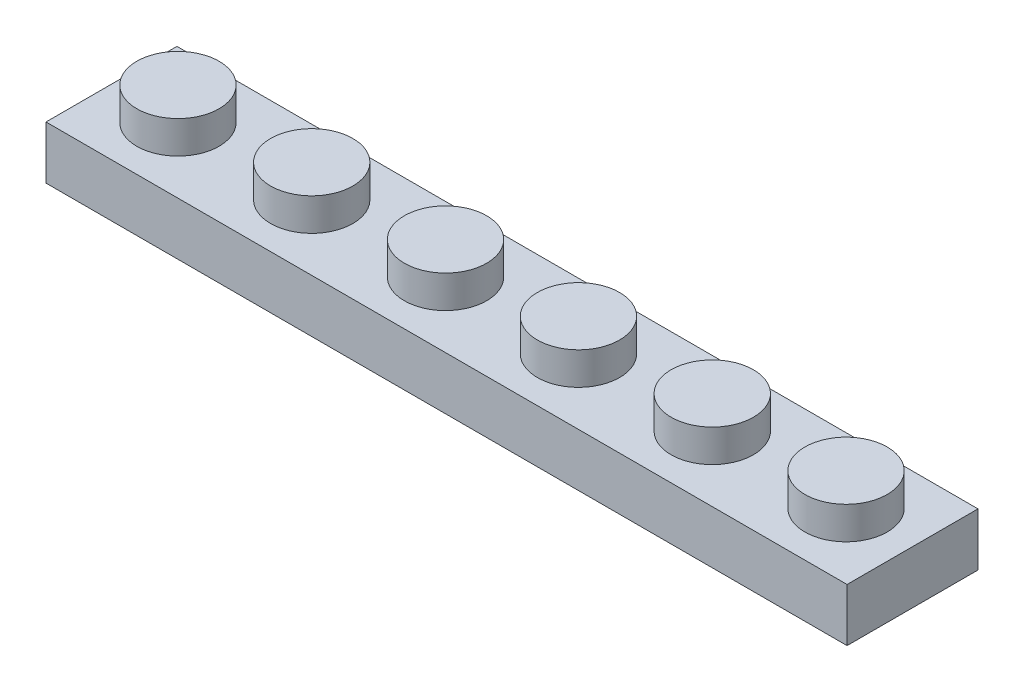
ISO-10303-21;
HEADER;
FILE_DESCRIPTION(('STEP AP214'),'2;1');
FILE_NAME('part.step','',(''),(''),'','','');
FILE_SCHEMA(('AUTOMOTIVE_DESIGN { 1 0 10303 214 1 1 1 1 }'));
ENDSEC;
DATA;
#1=APPLICATION_CONTEXT('core data for automotive mechanical design processes');
#2=APPLICATION_PROTOCOL_DEFINITION('international standard','automotive_design',2000,#1);
#3=PRODUCT_CONTEXT('',#1,'mechanical');
#4=PRODUCT('Part','Part','',(#3));
#5=PRODUCT_RELATED_PRODUCT_CATEGORY('part','',(#4));
#6=PRODUCT_DEFINITION_FORMATION('','',#4);
#7=PRODUCT_DEFINITION_CONTEXT('part definition',#1,'design');
#8=PRODUCT_DEFINITION('design','',#6,#7);
#9=PRODUCT_DEFINITION_SHAPE('','',#8);
#10=(LENGTH_UNIT() NAMED_UNIT(*) SI_UNIT(.MILLI.,.METRE.));
#11=(NAMED_UNIT(*) PLANE_ANGLE_UNIT() SI_UNIT($,.RADIAN.));
#12=(NAMED_UNIT(*) SI_UNIT($,.STERADIAN.) SOLID_ANGLE_UNIT());
#13=UNCERTAINTY_MEASURE_WITH_UNIT(LENGTH_MEASURE(1.E-05),#10,'distance_accuracy_value','');
#14=(GEOMETRIC_REPRESENTATION_CONTEXT(3) GLOBAL_UNCERTAINTY_ASSIGNED_CONTEXT((#13)) GLOBAL_UNIT_ASSIGNED_CONTEXT((#10,
#11,#12)) REPRESENTATION_CONTEXT('',''));
#15=CARTESIAN_POINT('',(0.,0.,0.));
#16=DIRECTION('',(0.,0.,1.));
#17=DIRECTION('',(1.,0.,0.));
#18=AXIS2_PLACEMENT_3D('',#15,#16,#17);
#19=CARTESIAN_POINT('',(-23.89,-1.58,-7.81));
#20=DIRECTION('',(0.,-1.,0.));
#21=DIRECTION('',(0.,0.,-1.));
#22=AXIS2_PLACEMENT_3D('',#19,#20,#21);
#23=PLANE('',#22);
#24=DIRECTION('',(1.,0.,0.));
#25=VECTOR('',#24,1.);
#26=CARTESIAN_POINT('',(-23.89,-1.58,0.));
#27=LINE('',#26,#25);
#28=CARTESIAN_POINT('',(-23.89,-1.58,0.));
#29=VERTEX_POINT('',#28);
#30=CARTESIAN_POINT('',(23.89,-1.58,0.));
#31=VERTEX_POINT('',#30);
#32=EDGE_CURVE('E229',#29,#31,#27,.T.);
#33=ORIENTED_EDGE('',*,*,#32,.F.);
#34=DIRECTION('',(0.,0.,1.));
#35=VECTOR('',#34,1.);
#36=CARTESIAN_POINT('',(-23.89,-1.58,-7.81));
#37=LINE('',#36,#35);
#38=CARTESIAN_POINT('',(-23.89,-1.58,-7.81));
#39=VERTEX_POINT('',#38);
#40=EDGE_CURVE('E248',#39,#29,#37,.T.);
#41=ORIENTED_EDGE('',*,*,#40,.F.);
#42=DIRECTION('',(1.,0.,0.));
#43=VECTOR('',#42,1.);
#44=CARTESIAN_POINT('',(-23.89,-1.58,-7.81));
#45=LINE('',#44,#43);
#46=CARTESIAN_POINT('',(23.89,-1.58,-7.81));
#47=VERTEX_POINT('',#46);
#48=EDGE_CURVE('E234',#39,#47,#45,.T.);
#49=ORIENTED_EDGE('',*,*,#48,.T.);
#50=DIRECTION('',(0.,0.,1.));
#51=VECTOR('',#50,1.);
#52=CARTESIAN_POINT('',(23.89,-1.58,-7.81));
#53=LINE('',#52,#51);
#54=EDGE_CURVE('E59',#47,#31,#53,.T.);
#55=ORIENTED_EDGE('',*,*,#54,.T.);
#56=EDGE_LOOP('',(#33,#41,#49,#55));
#57=FACE_BOUND('',#56,.T.);
#58=DIRECTION('',(0.,0.,1.));
#59=VECTOR('',#58,1.);
#60=CARTESIAN_POINT('',(-22.29,-1.58,-7.81));
#61=LINE('',#60,#59);
#62=CARTESIAN_POINT('',(-22.29,-1.58,-6.21));
#63=VERTEX_POINT('',#62);
#64=CARTESIAN_POINT('',(-22.29,-1.58,-1.6));
#65=VERTEX_POINT('',#64);
#66=EDGE_CURVE('E171',#63,#65,#61,.T.);
#67=ORIENTED_EDGE('',*,*,#66,.T.);
#68=DIRECTION('',(1.,0.,0.));
#69=VECTOR('',#68,1.);
#70=CARTESIAN_POINT('',(0.,-1.58,-1.6));
#71=LINE('',#70,#69);
#72=CARTESIAN_POINT('',(22.29,-1.58,-1.6));
#73=VERTEX_POINT('',#72);
#74=EDGE_CURVE('E143',#65,#73,#71,.T.);
#75=ORIENTED_EDGE('',*,*,#74,.T.);
#76=DIRECTION('',(0.,0.,1.));
#77=VECTOR('',#76,1.);
#78=CARTESIAN_POINT('',(22.29,-1.58,-7.81));
#79=LINE('',#78,#77);
#80=CARTESIAN_POINT('',(22.29,-1.58,-6.21));
#81=VERTEX_POINT('',#80);
#82=EDGE_CURVE('E132',#81,#73,#79,.T.);
#83=ORIENTED_EDGE('',*,*,#82,.F.);
#84=DIRECTION('',(1.,0.,0.));
#85=VECTOR('',#84,1.);
#86=CARTESIAN_POINT('',(0.,-1.58,-6.21));
#87=LINE('',#86,#85);
#88=EDGE_CURVE('E50',#63,#81,#87,.T.);
#89=ORIENTED_EDGE('',*,*,#88,.F.);
#90=EDGE_LOOP('',(#67,#75,#83,#89));
#91=FACE_BOUND('',#90,.T.);
#92=ADVANCED_FACE('F35',(#57,#91),#23,.T.);
#93=CARTESIAN_POINT('',(23.89,1.58,-7.81));
#94=DIRECTION('',(1.,0.,0.));
#95=DIRECTION('',(0.,0.,-1.));
#96=AXIS2_PLACEMENT_3D('',#93,#94,#95);
#97=PLANE('',#96);
#98=DIRECTION('',(0.,1.,0.));
#99=VECTOR('',#98,1.);
#100=CARTESIAN_POINT('',(23.89,1.58,0.));
#101=LINE('',#100,#99);
#102=CARTESIAN_POINT('',(23.89,1.58,0.));
#103=VERTEX_POINT('',#102);
#104=EDGE_CURVE('E223',#31,#103,#101,.T.);
#105=ORIENTED_EDGE('',*,*,#104,.F.);
#106=ORIENTED_EDGE('',*,*,#54,.F.);
#107=DIRECTION('',(0.,1.,0.));
#108=VECTOR('',#107,1.);
#109=CARTESIAN_POINT('',(23.89,1.58,-7.81));
#110=LINE('',#109,#108);
#111=CARTESIAN_POINT('',(23.89,1.58,-7.81));
#112=VERTEX_POINT('',#111);
#113=EDGE_CURVE('E226',#47,#112,#110,.T.);
#114=ORIENTED_EDGE('',*,*,#113,.T.);
#115=DIRECTION('',(0.,0.,1.));
#116=VECTOR('',#115,1.);
#117=CARTESIAN_POINT('',(23.89,1.58,-7.81));
#118=LINE('',#117,#116);
#119=EDGE_CURVE('E85',#112,#103,#118,.T.);
#120=ORIENTED_EDGE('',*,*,#119,.T.);
#121=EDGE_LOOP('',(#105,#106,#114,#120));
#122=FACE_BOUND('',#121,.T.);
#123=ADVANCED_FACE('F37',(#122),#97,.T.);
#124=CARTESIAN_POINT('',(-23.89,1.58,-7.81));
#125=DIRECTION('',(-1.,0.,0.));
#126=DIRECTION('',(0.,0.,1.));
#127=AXIS2_PLACEMENT_3D('',#124,#125,#126);
#128=PLANE('',#127);
#129=DIRECTION('',(0.,-1.,0.));
#130=VECTOR('',#129,1.);
#131=CARTESIAN_POINT('',(-23.89,1.58,0.));
#132=LINE('',#131,#130);
#133=CARTESIAN_POINT('',(-23.89,1.58,0.));
#134=VERTEX_POINT('',#133);
#135=EDGE_CURVE('E241',#134,#29,#132,.T.);
#136=ORIENTED_EDGE('',*,*,#135,.F.);
#137=DIRECTION('',(0.,0.,1.));
#138=VECTOR('',#137,1.);
#139=CARTESIAN_POINT('',(-23.89,1.58,-7.81));
#140=LINE('',#139,#138);
#141=CARTESIAN_POINT('',(-23.89,1.58,-7.81));
#142=VERTEX_POINT('',#141);
#143=EDGE_CURVE('E250',#142,#134,#140,.T.);
#144=ORIENTED_EDGE('',*,*,#143,.F.);
#145=DIRECTION('',(0.,-1.,0.));
#146=VECTOR('',#145,1.);
#147=CARTESIAN_POINT('',(-23.89,1.58,-7.81));
#148=LINE('',#147,#146);
#149=EDGE_CURVE('E231',#142,#39,#148,.T.);
#150=ORIENTED_EDGE('',*,*,#149,.T.);
#151=ORIENTED_EDGE('',*,*,#40,.T.);
#152=EDGE_LOOP('',(#136,#144,#150,#151));
#153=FACE_BOUND('',#152,.T.);
#154=ADVANCED_FACE('F310',(#153),#128,.T.);
#155=CARTESIAN_POINT('',(-23.89,1.58,-7.81));
#156=DIRECTION('',(0.,1.,0.));
#157=DIRECTION('',(0.,0.,1.));
#158=AXIS2_PLACEMENT_3D('',#155,#156,#157);
#159=PLANE('',#158);
#160=CARTESIAN_POINT('',(19.925,1.58,-3.905));
#161=DIRECTION('',(0.,1.,0.));
#162=DIRECTION('',(0.,0.,-1.));
#163=AXIS2_PLACEMENT_3D('',#160,#161,#162);
#164=CIRCLE('',#163,2.455);
#165=CARTESIAN_POINT('',(19.925,1.58,-6.36));
#166=VERTEX_POINT('',#165);
#167=EDGE_CURVE('E185',#166,#166,#164,.T.);
#168=ORIENTED_EDGE('',*,*,#167,.F.);
#169=EDGE_LOOP('',(#168));
#170=FACE_BOUND('',#169,.T.);
#171=CARTESIAN_POINT('',(11.945,1.58,-3.905));
#172=DIRECTION('',(0.,1.,0.));
#173=DIRECTION('',(0.,0.,-1.));
#174=AXIS2_PLACEMENT_3D('',#171,#172,#173);
#175=CIRCLE('',#174,2.455);
#176=CARTESIAN_POINT('',(11.945,1.58,-6.36));
#177=VERTEX_POINT('',#176);
#178=EDGE_CURVE('E193',#177,#177,#175,.T.);
#179=ORIENTED_EDGE('',*,*,#178,.F.);
#180=EDGE_LOOP('',(#179));
#181=FACE_BOUND('',#180,.T.);
#182=CARTESIAN_POINT('',(3.96500000000001,1.58,-3.905));
#183=DIRECTION('',(0.,1.,0.));
#184=DIRECTION('',(0.,0.,-1.));
#185=AXIS2_PLACEMENT_3D('',#182,#183,#184);
#186=CIRCLE('',#185,2.455);
#187=CARTESIAN_POINT('',(3.96500000000001,1.58,-6.36));
#188=VERTEX_POINT('',#187);
#189=EDGE_CURVE('E199',#188,#188,#186,.T.);
#190=ORIENTED_EDGE('',*,*,#189,.F.);
#191=EDGE_LOOP('',(#190));
#192=FACE_BOUND('',#191,.T.);
#193=CARTESIAN_POINT('',(-3.96500000000001,1.58,-3.905));
#194=DIRECTION('',(0.,1.,0.));
#195=DIRECTION('',(0.,0.,1.));
#196=AXIS2_PLACEMENT_3D('',#193,#194,#195);
#197=CIRCLE('',#196,2.455);
#198=CARTESIAN_POINT('',(-3.96500000000001,1.58,-1.45));
#199=VERTEX_POINT('',#198);
#200=EDGE_CURVE('E205',#199,#199,#197,.T.);
#201=ORIENTED_EDGE('',*,*,#200,.F.);
#202=EDGE_LOOP('',(#201));
#203=FACE_BOUND('',#202,.T.);
#204=CARTESIAN_POINT('',(-11.945,1.58,-3.905));
#205=DIRECTION('',(0.,1.,0.));
#206=DIRECTION('',(0.,0.,1.));
#207=AXIS2_PLACEMENT_3D('',#204,#205,#206);
#208=CIRCLE('',#207,2.455);
#209=CARTESIAN_POINT('',(-11.945,1.58,-1.45));
#210=VERTEX_POINT('',#209);
#211=EDGE_CURVE('E211',#210,#210,#208,.T.);
#212=ORIENTED_EDGE('',*,*,#211,.F.);
#213=EDGE_LOOP('',(#212));
#214=FACE_BOUND('',#213,.T.);
#215=CARTESIAN_POINT('',(-19.925,1.58,-3.905));
#216=DIRECTION('',(0.,1.,0.));
#217=DIRECTION('',(0.,0.,1.));
#218=AXIS2_PLACEMENT_3D('',#215,#216,#217);
#219=CIRCLE('',#218,2.455);
#220=CARTESIAN_POINT('',(-19.925,1.58,-1.45));
#221=VERTEX_POINT('',#220);
#222=EDGE_CURVE('E217',#221,#221,#219,.T.);
#223=ORIENTED_EDGE('',*,*,#222,.F.);
#224=EDGE_LOOP('',(#223));
#225=FACE_BOUND('',#224,.T.);
#226=DIRECTION('',(-1.,0.,0.));
#227=VECTOR('',#226,1.);
#228=CARTESIAN_POINT('',(-23.89,1.58,0.));
#229=LINE('',#228,#227);
#230=EDGE_CURVE('E238',#103,#134,#229,.T.);
#231=ORIENTED_EDGE('',*,*,#230,.F.);
#232=ORIENTED_EDGE('',*,*,#119,.F.);
#233=DIRECTION('',(-1.,0.,0.));
#234=VECTOR('',#233,1.);
#235=CARTESIAN_POINT('',(-23.89,1.58,-7.81));
#236=LINE('',#235,#234);
#237=EDGE_CURVE('E228',#112,#142,#236,.T.);
#238=ORIENTED_EDGE('',*,*,#237,.T.);
#239=ORIENTED_EDGE('',*,*,#143,.T.);
#240=EDGE_LOOP('',(#231,#232,#238,#239));
#241=FACE_BOUND('',#240,.T.);
#242=ADVANCED_FACE('F317',(#170,#181,#192,#203,#214,#225,#241),#159,.T.);
#243=CARTESIAN_POINT('',(0.,0.,-7.81));
#244=DIRECTION('',(0.,0.,1.));
#245=DIRECTION('',(1.,0.,0.));
#246=AXIS2_PLACEMENT_3D('',#243,#244,#245);
#247=PLANE('',#246);
#248=ORIENTED_EDGE('',*,*,#113,.F.);
#249=ORIENTED_EDGE('',*,*,#48,.F.);
#250=ORIENTED_EDGE('',*,*,#149,.F.);
#251=ORIENTED_EDGE('',*,*,#237,.F.);
#252=EDGE_LOOP('',(#248,#249,#250,#251));
#253=FACE_BOUND('',#252,.T.);
#254=ADVANCED_FACE('F320',(#253),#247,.F.);
#255=CARTESIAN_POINT('',(0.,0.,0.));
#256=DIRECTION('',(0.,0.,1.));
#257=DIRECTION('',(1.,0.,0.));
#258=AXIS2_PLACEMENT_3D('',#255,#256,#257);
#259=PLANE('',#258);
#260=ORIENTED_EDGE('',*,*,#104,.T.);
#261=ORIENTED_EDGE('',*,*,#230,.T.);
#262=ORIENTED_EDGE('',*,*,#135,.T.);
#263=ORIENTED_EDGE('',*,*,#32,.T.);
#264=EDGE_LOOP('',(#260,#261,#262,#263));
#265=FACE_BOUND('',#264,.T.);
#266=ADVANCED_FACE('F314',(#265),#259,.T.);
#267=CARTESIAN_POINT('',(-19.925,3.52,-3.905));
#268=DIRECTION('',(0.,-1.,0.));
#269=DIRECTION('',(0.,0.,-1.));
#270=AXIS2_PLACEMENT_3D('',#267,#268,#269);
#271=CYLINDRICAL_SURFACE('',#270,2.455);
#272=CARTESIAN_POINT('',(-19.925,3.52,-3.905));
#273=DIRECTION('',(0.,1.,0.));
#274=DIRECTION('',(0.,0.,1.));
#275=AXIS2_PLACEMENT_3D('',#272,#273,#274);
#276=CIRCLE('',#275,2.455);
#277=CARTESIAN_POINT('',(-19.925,3.52,-1.45));
#278=VERTEX_POINT('',#277);
#279=EDGE_CURVE('E220',#278,#278,#276,.T.);
#280=ORIENTED_EDGE('',*,*,#279,.F.);
#281=EDGE_LOOP('',(#280));
#282=FACE_BOUND('',#281,.T.);
#283=ORIENTED_EDGE('',*,*,#222,.T.);
#284=EDGE_LOOP('',(#283));
#285=FACE_BOUND('',#284,.T.);
#286=ADVANCED_FACE('F342',(#282,#285),#271,.T.);
#287=CARTESIAN_POINT('',(-19.925,3.52,-3.905));
#288=DIRECTION('',(0.,1.,0.));
#289=DIRECTION('',(0.,0.,1.));
#290=AXIS2_PLACEMENT_3D('',#287,#288,#289);
#291=PLANE('',#290);
#292=ORIENTED_EDGE('',*,*,#279,.T.);
#293=EDGE_LOOP('',(#292));
#294=FACE_BOUND('',#293,.T.);
#295=ADVANCED_FACE('F346',(#294),#291,.T.);
#296=CARTESIAN_POINT('',(-11.945,3.52,-3.905));
#297=DIRECTION('',(0.,-1.,0.));
#298=DIRECTION('',(0.,0.,-1.));
#299=AXIS2_PLACEMENT_3D('',#296,#297,#298);
#300=CYLINDRICAL_SURFACE('',#299,2.455);
#301=CARTESIAN_POINT('',(-11.945,3.52,-3.905));
#302=DIRECTION('',(0.,1.,0.));
#303=DIRECTION('',(0.,0.,1.));
#304=AXIS2_PLACEMENT_3D('',#301,#302,#303);
#305=CIRCLE('',#304,2.455);
#306=CARTESIAN_POINT('',(-11.945,3.52,-1.45));
#307=VERTEX_POINT('',#306);
#308=EDGE_CURVE('E214',#307,#307,#305,.T.);
#309=ORIENTED_EDGE('',*,*,#308,.F.);
#310=EDGE_LOOP('',(#309));
#311=FACE_BOUND('',#310,.T.);
#312=ORIENTED_EDGE('',*,*,#211,.T.);
#313=EDGE_LOOP('',(#312));
#314=FACE_BOUND('',#313,.T.);
#315=ADVANCED_FACE('F352',(#311,#314),#300,.T.);
#316=CARTESIAN_POINT('',(-11.945,3.52,-3.905));
#317=DIRECTION('',(0.,1.,0.));
#318=DIRECTION('',(0.,0.,1.));
#319=AXIS2_PLACEMENT_3D('',#316,#317,#318);
#320=PLANE('',#319);
#321=ORIENTED_EDGE('',*,*,#308,.T.);
#322=EDGE_LOOP('',(#321));
#323=FACE_BOUND('',#322,.T.);
#324=ADVANCED_FACE('F360',(#323),#320,.T.);
#325=CARTESIAN_POINT('',(-3.96500000000001,3.52,-3.905));
#326=DIRECTION('',(0.,-1.,0.));
#327=DIRECTION('',(0.,0.,-1.));
#328=AXIS2_PLACEMENT_3D('',#325,#326,#327);
#329=CYLINDRICAL_SURFACE('',#328,2.455);
#330=CARTESIAN_POINT('',(-3.96500000000001,3.52,-3.905));
#331=DIRECTION('',(0.,1.,0.));
#332=DIRECTION('',(0.,0.,1.));
#333=AXIS2_PLACEMENT_3D('',#330,#331,#332);
#334=CIRCLE('',#333,2.455);
#335=CARTESIAN_POINT('',(-3.96500000000001,3.52,-1.45));
#336=VERTEX_POINT('',#335);
#337=EDGE_CURVE('E208',#336,#336,#334,.T.);
#338=ORIENTED_EDGE('',*,*,#337,.F.);
#339=EDGE_LOOP('',(#338));
#340=FACE_BOUND('',#339,.T.);
#341=ORIENTED_EDGE('',*,*,#200,.T.);
#342=EDGE_LOOP('',(#341));
#343=FACE_BOUND('',#342,.T.);
#344=ADVANCED_FACE('F364',(#340,#343),#329,.T.);
#345=CARTESIAN_POINT('',(-3.96500000000001,3.52,-3.905));
#346=DIRECTION('',(0.,1.,0.));
#347=DIRECTION('',(0.,0.,1.));
#348=AXIS2_PLACEMENT_3D('',#345,#346,#347);
#349=PLANE('',#348);
#350=ORIENTED_EDGE('',*,*,#337,.T.);
#351=EDGE_LOOP('',(#350));
#352=FACE_BOUND('',#351,.T.);
#353=ADVANCED_FACE('F368',(#352),#349,.T.);
#354=CARTESIAN_POINT('',(3.96500000000001,3.52,-3.905));
#355=DIRECTION('',(0.,-1.,0.));
#356=DIRECTION('',(0.,0.,-1.));
#357=AXIS2_PLACEMENT_3D('',#354,#355,#356);
#358=CYLINDRICAL_SURFACE('',#357,2.455);
#359=CARTESIAN_POINT('',(3.96500000000001,3.52,-3.905));
#360=DIRECTION('',(0.,1.,0.));
#361=DIRECTION('',(0.,0.,-1.));
#362=AXIS2_PLACEMENT_3D('',#359,#360,#361);
#363=CIRCLE('',#362,2.455);
#364=CARTESIAN_POINT('',(3.96500000000001,3.52,-6.36));
#365=VERTEX_POINT('',#364);
#366=EDGE_CURVE('E202',#365,#365,#363,.T.);
#367=ORIENTED_EDGE('',*,*,#366,.F.);
#368=EDGE_LOOP('',(#367));
#369=FACE_BOUND('',#368,.T.);
#370=ORIENTED_EDGE('',*,*,#189,.T.);
#371=EDGE_LOOP('',(#370));
#372=FACE_BOUND('',#371,.T.);
#373=ADVANCED_FACE('F372',(#369,#372),#358,.T.);
#374=CARTESIAN_POINT('',(3.96500000000001,3.52,-3.905));
#375=DIRECTION('',(0.,-1.,0.));
#376=DIRECTION('',(0.,0.,-1.));
#377=AXIS2_PLACEMENT_3D('',#374,#375,#376);
#378=PLANE('',#377);
#379=ORIENTED_EDGE('',*,*,#366,.T.);
#380=EDGE_LOOP('',(#379));
#381=FACE_BOUND('',#380,.T.);
#382=ADVANCED_FACE('F376',(#381),#378,.F.);
#383=CARTESIAN_POINT('',(11.945,3.52,-3.905));
#384=DIRECTION('',(0.,-1.,0.));
#385=DIRECTION('',(0.,0.,-1.));
#386=AXIS2_PLACEMENT_3D('',#383,#384,#385);
#387=CYLINDRICAL_SURFACE('',#386,2.455);
#388=CARTESIAN_POINT('',(11.945,3.52,-3.905));
#389=DIRECTION('',(0.,1.,0.));
#390=DIRECTION('',(0.,0.,-1.));
#391=AXIS2_PLACEMENT_3D('',#388,#389,#390);
#392=CIRCLE('',#391,2.455);
#393=CARTESIAN_POINT('',(11.945,3.52,-6.36));
#394=VERTEX_POINT('',#393);
#395=EDGE_CURVE('E196',#394,#394,#392,.T.);
#396=ORIENTED_EDGE('',*,*,#395,.F.);
#397=EDGE_LOOP('',(#396));
#398=FACE_BOUND('',#397,.T.);
#399=ORIENTED_EDGE('',*,*,#178,.T.);
#400=EDGE_LOOP('',(#399));
#401=FACE_BOUND('',#400,.T.);
#402=ADVANCED_FACE('F380',(#398,#401),#387,.T.);
#403=CARTESIAN_POINT('',(11.945,3.52,-3.905));
#404=DIRECTION('',(0.,-1.,0.));
#405=DIRECTION('',(0.,0.,-1.));
#406=AXIS2_PLACEMENT_3D('',#403,#404,#405);
#407=PLANE('',#406);
#408=ORIENTED_EDGE('',*,*,#395,.T.);
#409=EDGE_LOOP('',(#408));
#410=FACE_BOUND('',#409,.T.);
#411=ADVANCED_FACE('F384',(#410),#407,.F.);
#412=CARTESIAN_POINT('',(19.925,3.52,-3.905));
#413=DIRECTION('',(0.,-1.,0.));
#414=DIRECTION('',(0.,0.,-1.));
#415=AXIS2_PLACEMENT_3D('',#412,#413,#414);
#416=CYLINDRICAL_SURFACE('',#415,2.455);
#417=CARTESIAN_POINT('',(19.925,3.52,-3.905));
#418=DIRECTION('',(0.,1.,0.));
#419=DIRECTION('',(0.,0.,-1.));
#420=AXIS2_PLACEMENT_3D('',#417,#418,#419);
#421=CIRCLE('',#420,2.455);
#422=CARTESIAN_POINT('',(19.925,3.52,-6.36));
#423=VERTEX_POINT('',#422);
#424=EDGE_CURVE('E190',#423,#423,#421,.T.);
#425=ORIENTED_EDGE('',*,*,#424,.F.);
#426=EDGE_LOOP('',(#425));
#427=FACE_BOUND('',#426,.T.);
#428=ORIENTED_EDGE('',*,*,#167,.T.);
#429=EDGE_LOOP('',(#428));
#430=FACE_BOUND('',#429,.T.);
#431=ADVANCED_FACE('F388',(#427,#430),#416,.T.);
#432=CARTESIAN_POINT('',(19.925,3.52,-3.905));
#433=DIRECTION('',(0.,-1.,0.));
#434=DIRECTION('',(0.,0.,-1.));
#435=AXIS2_PLACEMENT_3D('',#432,#433,#434);
#436=PLANE('',#435);
#437=ORIENTED_EDGE('',*,*,#424,.T.);
#438=EDGE_LOOP('',(#437));
#439=FACE_BOUND('',#438,.T.);
#440=ADVANCED_FACE('F392',(#439),#436,.F.);
#441=CARTESIAN_POINT('',(22.29,1.58,-7.81));
#442=DIRECTION('',(1.,0.,0.));
#443=DIRECTION('',(0.,0.,-1.));
#444=AXIS2_PLACEMENT_3D('',#441,#442,#443);
#445=PLANE('',#444);
#446=DIRECTION('',(0.,1.,0.));
#447=VECTOR('',#446,1.);
#448=CARTESIAN_POINT('',(22.29,0.,-1.6));
#449=LINE('',#448,#447);
#450=CARTESIAN_POINT('',(22.29,-0.0200000000000003,-1.6));
#451=VERTEX_POINT('',#450);
#452=EDGE_CURVE('E126',#73,#451,#449,.T.);
#453=ORIENTED_EDGE('',*,*,#452,.T.);
#454=DIRECTION('',(0.,0.,1.));
#455=VECTOR('',#454,1.);
#456=CARTESIAN_POINT('',(22.29,-0.0200000000000003,-7.81));
#457=LINE('',#456,#455);
#458=CARTESIAN_POINT('',(22.29,-0.0200000000000003,-6.21));
#459=VERTEX_POINT('',#458);
#460=EDGE_CURVE('E111',#459,#451,#457,.T.);
#461=ORIENTED_EDGE('',*,*,#460,.F.);
#462=DIRECTION('',(0.,1.,0.));
#463=VECTOR('',#462,1.);
#464=CARTESIAN_POINT('',(22.29,0.,-6.21));
#465=LINE('',#464,#463);
#466=EDGE_CURVE('E142',#81,#459,#465,.T.);
#467=ORIENTED_EDGE('',*,*,#466,.F.);
#468=ORIENTED_EDGE('',*,*,#82,.T.);
#469=EDGE_LOOP('',(#453,#461,#467,#468));
#470=FACE_BOUND('',#469,.T.);
#471=ADVANCED_FACE('F130',(#470),#445,.F.);
#472=CARTESIAN_POINT('',(-22.29,1.58,-7.81));
#473=DIRECTION('',(-1.,0.,0.));
#474=DIRECTION('',(0.,0.,1.));
#475=AXIS2_PLACEMENT_3D('',#472,#473,#474);
#476=PLANE('',#475);
#477=DIRECTION('',(0.,-1.,0.));
#478=VECTOR('',#477,1.);
#479=CARTESIAN_POINT('',(-22.29,0.,-1.6));
#480=LINE('',#479,#478);
#481=CARTESIAN_POINT('',(-22.29,-0.0200000000000003,-1.6));
#482=VERTEX_POINT('',#481);
#483=EDGE_CURVE('E128',#482,#65,#480,.T.);
#484=ORIENTED_EDGE('',*,*,#483,.T.);
#485=ORIENTED_EDGE('',*,*,#66,.F.);
#486=DIRECTION('',(0.,-1.,0.));
#487=VECTOR('',#486,1.);
#488=CARTESIAN_POINT('',(-22.29,0.,-6.21));
#489=LINE('',#488,#487);
#490=CARTESIAN_POINT('',(-22.29,-0.0200000000000003,-6.21));
#491=VERTEX_POINT('',#490);
#492=EDGE_CURVE('E169',#491,#63,#489,.T.);
#493=ORIENTED_EDGE('',*,*,#492,.F.);
#494=DIRECTION('',(0.,0.,1.));
#495=VECTOR('',#494,1.);
#496=CARTESIAN_POINT('',(-22.29,-0.0200000000000003,-7.81));
#497=LINE('',#496,#495);
#498=EDGE_CURVE('E119',#491,#482,#497,.T.);
#499=ORIENTED_EDGE('',*,*,#498,.T.);
#500=EDGE_LOOP('',(#484,#485,#493,#499));
#501=FACE_BOUND('',#500,.T.);
#502=ADVANCED_FACE('F269',(#501),#476,.F.);
#503=CARTESIAN_POINT('',(-23.89,-0.0200000000000003,-7.81));
#504=DIRECTION('',(0.,1.,0.));
#505=DIRECTION('',(0.,0.,1.));
#506=AXIS2_PLACEMENT_3D('',#503,#504,#505);
#507=PLANE('',#506);
#508=CARTESIAN_POINT('',(0.,-0.0200000000000001,-3.905));
#509=DIRECTION('',(0.,1.,0.));
#510=DIRECTION('',(0.,0.,1.));
#511=AXIS2_PLACEMENT_3D('',#508,#509,#510);
#512=CIRCLE('',#511,1.495);
#513=CARTESIAN_POINT('',(0.,-0.0200000000000001,-2.41));
#514=VERTEX_POINT('',#513);
#515=EDGE_CURVE('E12',#514,#514,#512,.F.);
#516=ORIENTED_EDGE('',*,*,#515,.F.);
#517=EDGE_LOOP('',(#516));
#518=FACE_BOUND('',#517,.T.);
#519=CARTESIAN_POINT('',(15.935,-0.0200000000000001,-3.90499999999999));
#520=DIRECTION('',(0.,1.,0.));
#521=DIRECTION('',(0.,0.,1.));
#522=AXIS2_PLACEMENT_3D('',#519,#520,#521);
#523=CIRCLE('',#522,1.49499999999999);
#524=CARTESIAN_POINT('',(15.935,-0.0200000000000001,-2.41));
#525=VERTEX_POINT('',#524);
#526=EDGE_CURVE('E43',#525,#525,#523,.F.);
#527=ORIENTED_EDGE('',*,*,#526,.F.);
#528=EDGE_LOOP('',(#527));
#529=FACE_BOUND('',#528,.T.);
#530=CARTESIAN_POINT('',(7.95500000000001,-0.0200000000000001,-3.90499999999999));
#531=DIRECTION('',(0.,1.,0.));
#532=DIRECTION('',(0.,0.,1.));
#533=AXIS2_PLACEMENT_3D('',#530,#531,#532);
#534=CIRCLE('',#533,1.495);
#535=CARTESIAN_POINT('',(7.95500000000001,-0.0200000000000001,-2.40999999999999));
#536=VERTEX_POINT('',#535);
#537=EDGE_CURVE('E258',#536,#536,#534,.F.);
#538=ORIENTED_EDGE('',*,*,#537,.F.);
#539=EDGE_LOOP('',(#538));
#540=FACE_BOUND('',#539,.T.);
#541=CARTESIAN_POINT('',(-7.95500000000001,-0.0200000000000001,-3.905));
#542=DIRECTION('',(0.,1.,0.));
#543=DIRECTION('',(0.,0.,1.));
#544=AXIS2_PLACEMENT_3D('',#541,#542,#543);
#545=CIRCLE('',#544,1.495);
#546=CARTESIAN_POINT('',(-7.95500000000001,-0.0200000000000001,-2.41));
#547=VERTEX_POINT('',#546);
#548=EDGE_CURVE('E255',#547,#547,#545,.F.);
#549=ORIENTED_EDGE('',*,*,#548,.F.);
#550=EDGE_LOOP('',(#549));
#551=FACE_BOUND('',#550,.T.);
#552=CARTESIAN_POINT('',(-15.935,-0.0200000000000001,-3.905));
#553=DIRECTION('',(0.,1.,0.));
#554=DIRECTION('',(0.,0.,1.));
#555=AXIS2_PLACEMENT_3D('',#552,#553,#554);
#556=CIRCLE('',#555,1.495);
#557=CARTESIAN_POINT('',(-15.935,-0.0200000000000001,-2.41));
#558=VERTEX_POINT('',#557);
#559=EDGE_CURVE('E247',#558,#558,#556,.F.);
#560=ORIENTED_EDGE('',*,*,#559,.F.);
#561=EDGE_LOOP('',(#560));
#562=FACE_BOUND('',#561,.T.);
#563=CARTESIAN_POINT('',(19.925,-0.0200000000000005,-3.905));
#564=DIRECTION('',(0.,1.,0.));
#565=DIRECTION('',(0.,0.,1.));
#566=AXIS2_PLACEMENT_3D('',#563,#564,#565);
#567=CIRCLE('',#566,0.855);
#568=CARTESIAN_POINT('',(19.925,-0.0200000000000005,-3.05));
#569=VERTEX_POINT('',#568);
#570=EDGE_CURVE('E145',#569,#569,#567,.T.);
#571=ORIENTED_EDGE('',*,*,#570,.T.);
#572=EDGE_LOOP('',(#571));
#573=FACE_BOUND('',#572,.T.);
#574=CARTESIAN_POINT('',(11.945,-0.0200000000000005,-3.905));
#575=DIRECTION('',(0.,1.,0.));
#576=DIRECTION('',(0.,0.,1.));
#577=AXIS2_PLACEMENT_3D('',#574,#575,#576);
#578=CIRCLE('',#577,0.855000000000001);
#579=CARTESIAN_POINT('',(11.945,-0.0200000000000005,-3.05));
#580=VERTEX_POINT('',#579);
#581=EDGE_CURVE('E150',#580,#580,#578,.T.);
#582=ORIENTED_EDGE('',*,*,#581,.T.);
#583=EDGE_LOOP('',(#582));
#584=FACE_BOUND('',#583,.T.);
#585=CARTESIAN_POINT('',(3.96500000000001,-0.0200000000000005,-3.905));
#586=DIRECTION('',(0.,1.,0.));
#587=DIRECTION('',(0.,0.,1.));
#588=AXIS2_PLACEMENT_3D('',#585,#586,#587);
#589=CIRCLE('',#588,0.855);
#590=CARTESIAN_POINT('',(3.96500000000001,-0.0200000000000005,-3.05));
#591=VERTEX_POINT('',#590);
#592=EDGE_CURVE('E154',#591,#591,#589,.T.);
#593=ORIENTED_EDGE('',*,*,#592,.T.);
#594=EDGE_LOOP('',(#593));
#595=FACE_BOUND('',#594,.T.);
#596=CARTESIAN_POINT('',(-3.96500000000001,-0.0200000000000005,-3.905));
#597=DIRECTION('',(0.,1.,0.));
#598=DIRECTION('',(0.,0.,1.));
#599=AXIS2_PLACEMENT_3D('',#596,#597,#598);
#600=CIRCLE('',#599,0.855);
#601=CARTESIAN_POINT('',(-3.96500000000001,-0.0200000000000005,-3.05));
#602=VERTEX_POINT('',#601);
#603=EDGE_CURVE('E158',#602,#602,#600,.T.);
#604=ORIENTED_EDGE('',*,*,#603,.T.);
#605=EDGE_LOOP('',(#604));
#606=FACE_BOUND('',#605,.T.);
#607=CARTESIAN_POINT('',(-11.945,-0.0200000000000005,-3.905));
#608=DIRECTION('',(0.,1.,0.));
#609=DIRECTION('',(0.,0.,1.));
#610=AXIS2_PLACEMENT_3D('',#607,#608,#609);
#611=CIRCLE('',#610,0.855000000000001);
#612=CARTESIAN_POINT('',(-11.945,-0.0200000000000005,-3.05));
#613=VERTEX_POINT('',#612);
#614=EDGE_CURVE('E162',#613,#613,#611,.T.);
#615=ORIENTED_EDGE('',*,*,#614,.T.);
#616=EDGE_LOOP('',(#615));
#617=FACE_BOUND('',#616,.T.);
#618=CARTESIAN_POINT('',(-19.925,-0.0200000000000005,-3.905));
#619=DIRECTION('',(0.,1.,0.));
#620=DIRECTION('',(0.,0.,1.));
#621=AXIS2_PLACEMENT_3D('',#618,#619,#620);
#622=CIRCLE('',#621,0.855);
#623=CARTESIAN_POINT('',(-19.925,-0.0200000000000005,-3.05));
#624=VERTEX_POINT('',#623);
#625=EDGE_CURVE('E136',#624,#624,#622,.T.);
#626=ORIENTED_EDGE('',*,*,#625,.T.);
#627=EDGE_LOOP('',(#626));
#628=FACE_BOUND('',#627,.T.);
#629=DIRECTION('',(-1.,0.,0.));
#630=VECTOR('',#629,1.);
#631=CARTESIAN_POINT('',(0.,-0.0200000000000003,-1.6));
#632=LINE('',#631,#630);
#633=EDGE_CURVE('E114',#451,#482,#632,.T.);
#634=ORIENTED_EDGE('',*,*,#633,.T.);
#635=ORIENTED_EDGE('',*,*,#498,.F.);
#636=DIRECTION('',(-1.,0.,0.));
#637=VECTOR('',#636,1.);
#638=CARTESIAN_POINT('',(0.,-0.0200000000000003,-6.21));
#639=LINE('',#638,#637);
#640=EDGE_CURVE('E116',#459,#491,#639,.T.);
#641=ORIENTED_EDGE('',*,*,#640,.F.);
#642=ORIENTED_EDGE('',*,*,#460,.T.);
#643=EDGE_LOOP('',(#634,#635,#641,#642));
#644=FACE_BOUND('',#643,.T.);
#645=ADVANCED_FACE('F113',(#518,#529,#540,#551,#562,#573,#584,#595,#606,#617,#628,#644),#507,.F.);
#646=CARTESIAN_POINT('',(0.,0.,-6.21));
#647=DIRECTION('',(0.,0.,1.));
#648=DIRECTION('',(1.,0.,0.));
#649=AXIS2_PLACEMENT_3D('',#646,#647,#648);
#650=PLANE('',#649);
#651=ORIENTED_EDGE('',*,*,#466,.T.);
#652=ORIENTED_EDGE('',*,*,#640,.T.);
#653=ORIENTED_EDGE('',*,*,#492,.T.);
#654=ORIENTED_EDGE('',*,*,#88,.T.);
#655=EDGE_LOOP('',(#651,#652,#653,#654));
#656=FACE_BOUND('',#655,.T.);
#657=ADVANCED_FACE('F268',(#656),#650,.T.);
#658=CARTESIAN_POINT('',(0.,0.,-1.6));
#659=DIRECTION('',(0.,0.,1.));
#660=DIRECTION('',(1.,0.,0.));
#661=AXIS2_PLACEMENT_3D('',#658,#659,#660);
#662=PLANE('',#661);
#663=ORIENTED_EDGE('',*,*,#452,.F.);
#664=ORIENTED_EDGE('',*,*,#74,.F.);
#665=ORIENTED_EDGE('',*,*,#483,.F.);
#666=ORIENTED_EDGE('',*,*,#633,.F.);
#667=EDGE_LOOP('',(#663,#664,#665,#666));
#668=FACE_BOUND('',#667,.T.);
#669=ADVANCED_FACE('F124',(#668),#662,.F.);
#670=CARTESIAN_POINT('',(-19.925,3.52,-3.905));
#671=DIRECTION('',(0.,-1.,0.));
#672=DIRECTION('',(0.,0.,-1.));
#673=AXIS2_PLACEMENT_3D('',#670,#671,#672);
#674=CYLINDRICAL_SURFACE('',#673,0.855);
#675=CARTESIAN_POINT('',(-19.925,1.92,-3.905));
#676=DIRECTION('',(0.,1.,0.));
#677=DIRECTION('',(0.,0.,1.));
#678=AXIS2_PLACEMENT_3D('',#675,#676,#677);
#679=CIRCLE('',#678,0.855);
#680=CARTESIAN_POINT('',(-19.925,1.92,-3.05));
#681=VERTEX_POINT('',#680);
#682=EDGE_CURVE('E133',#681,#681,#679,.T.);
#683=ORIENTED_EDGE('',*,*,#682,.T.);
#684=EDGE_LOOP('',(#683));
#685=FACE_BOUND('',#684,.T.);
#686=ORIENTED_EDGE('',*,*,#625,.F.);
#687=EDGE_LOOP('',(#686));
#688=FACE_BOUND('',#687,.T.);
#689=ADVANCED_FACE('F292',(#685,#688),#674,.F.);
#690=CARTESIAN_POINT('',(-19.925,1.92,-3.905));
#691=DIRECTION('',(0.,1.,0.));
#692=DIRECTION('',(0.,0.,1.));
#693=AXIS2_PLACEMENT_3D('',#690,#691,#692);
#694=PLANE('',#693);
#695=ORIENTED_EDGE('',*,*,#682,.F.);
#696=EDGE_LOOP('',(#695));
#697=FACE_BOUND('',#696,.T.);
#698=ADVANCED_FACE('F294',(#697),#694,.F.);
#699=CARTESIAN_POINT('',(-11.945,3.52,-3.905));
#700=DIRECTION('',(0.,-1.,0.));
#701=DIRECTION('',(0.,0.,-1.));
#702=AXIS2_PLACEMENT_3D('',#699,#700,#701);
#703=CYLINDRICAL_SURFACE('',#702,0.855000000000001);
#704=CARTESIAN_POINT('',(-11.945,1.92,-3.905));
#705=DIRECTION('',(0.,1.,0.));
#706=DIRECTION('',(0.,0.,1.));
#707=AXIS2_PLACEMENT_3D('',#704,#705,#706);
#708=CIRCLE('',#707,0.855000000000001);
#709=CARTESIAN_POINT('',(-11.945,1.92,-3.05));
#710=VERTEX_POINT('',#709);
#711=EDGE_CURVE('E165',#710,#710,#708,.T.);
#712=ORIENTED_EDGE('',*,*,#711,.T.);
#713=EDGE_LOOP('',(#712));
#714=FACE_BOUND('',#713,.T.);
#715=ORIENTED_EDGE('',*,*,#614,.F.);
#716=EDGE_LOOP('',(#715));
#717=FACE_BOUND('',#716,.T.);
#718=ADVANCED_FACE('F301',(#714,#717),#703,.F.);
#719=CARTESIAN_POINT('',(-11.945,1.92,-3.905));
#720=DIRECTION('',(0.,1.,0.));
#721=DIRECTION('',(0.,0.,1.));
#722=AXIS2_PLACEMENT_3D('',#719,#720,#721);
#723=PLANE('',#722);
#724=ORIENTED_EDGE('',*,*,#711,.F.);
#725=EDGE_LOOP('',(#724));
#726=FACE_BOUND('',#725,.T.);
#727=ADVANCED_FACE('F429',(#726),#723,.F.);
#728=CARTESIAN_POINT('',(-3.96500000000001,3.52,-3.905));
#729=DIRECTION('',(0.,-1.,0.));
#730=DIRECTION('',(0.,0.,-1.));
#731=AXIS2_PLACEMENT_3D('',#728,#729,#730);
#732=CYLINDRICAL_SURFACE('',#731,0.855);
#733=CARTESIAN_POINT('',(-3.96500000000001,1.92,-3.905));
#734=DIRECTION('',(0.,1.,0.));
#735=DIRECTION('',(0.,0.,1.));
#736=AXIS2_PLACEMENT_3D('',#733,#734,#735);
#737=CIRCLE('',#736,0.855);
#738=CARTESIAN_POINT('',(-3.96500000000001,1.92,-3.05));
#739=VERTEX_POINT('',#738);
#740=EDGE_CURVE('E161',#739,#739,#737,.T.);
#741=ORIENTED_EDGE('',*,*,#740,.T.);
#742=EDGE_LOOP('',(#741));
#743=FACE_BOUND('',#742,.T.);
#744=ORIENTED_EDGE('',*,*,#603,.F.);
#745=EDGE_LOOP('',(#744));
#746=FACE_BOUND('',#745,.T.);
#747=ADVANCED_FACE('F425',(#743,#746),#732,.F.);
#748=CARTESIAN_POINT('',(-3.96500000000001,1.92,-3.905));
#749=DIRECTION('',(0.,1.,0.));
#750=DIRECTION('',(0.,0.,1.));
#751=AXIS2_PLACEMENT_3D('',#748,#749,#750);
#752=PLANE('',#751);
#753=ORIENTED_EDGE('',*,*,#740,.F.);
#754=EDGE_LOOP('',(#753));
#755=FACE_BOUND('',#754,.T.);
#756=ADVANCED_FACE('F421',(#755),#752,.F.);
#757=CARTESIAN_POINT('',(3.96500000000001,3.52,-3.905));
#758=DIRECTION('',(0.,-1.,0.));
#759=DIRECTION('',(0.,0.,-1.));
#760=AXIS2_PLACEMENT_3D('',#757,#758,#759);
#761=CYLINDRICAL_SURFACE('',#760,0.855);
#762=CARTESIAN_POINT('',(3.96500000000001,1.92,-3.905));
#763=DIRECTION('',(0.,-1.,0.));
#764=DIRECTION('',(0.,0.,-1.));
#765=AXIS2_PLACEMENT_3D('',#762,#763,#764);
#766=CIRCLE('',#765,0.855);
#767=CARTESIAN_POINT('',(3.96500000000001,1.92,-4.76));
#768=VERTEX_POINT('',#767);
#769=EDGE_CURVE('E157',#768,#768,#766,.F.);
#770=ORIENTED_EDGE('',*,*,#769,.T.);
#771=EDGE_LOOP('',(#770));
#772=FACE_BOUND('',#771,.T.);
#773=ORIENTED_EDGE('',*,*,#592,.F.);
#774=EDGE_LOOP('',(#773));
#775=FACE_BOUND('',#774,.T.);
#776=ADVANCED_FACE('F417',(#772,#775),#761,.F.);
#777=CARTESIAN_POINT('',(3.96500000000001,1.92,-3.905));
#778=DIRECTION('',(0.,-1.,0.));
#779=DIRECTION('',(0.,0.,-1.));
#780=AXIS2_PLACEMENT_3D('',#777,#778,#779);
#781=PLANE('',#780);
#782=ORIENTED_EDGE('',*,*,#769,.F.);
#783=EDGE_LOOP('',(#782));
#784=FACE_BOUND('',#783,.T.);
#785=ADVANCED_FACE('F413',(#784),#781,.T.);
#786=CARTESIAN_POINT('',(11.945,3.52,-3.905));
#787=DIRECTION('',(0.,-1.,0.));
#788=DIRECTION('',(0.,0.,-1.));
#789=AXIS2_PLACEMENT_3D('',#786,#787,#788);
#790=CYLINDRICAL_SURFACE('',#789,0.855000000000001);
#791=CARTESIAN_POINT('',(11.945,1.92,-3.905));
#792=DIRECTION('',(0.,-1.,0.));
#793=DIRECTION('',(0.,0.,-1.));
#794=AXIS2_PLACEMENT_3D('',#791,#792,#793);
#795=CIRCLE('',#794,0.855000000000001);
#796=CARTESIAN_POINT('',(11.945,1.92,-4.76));
#797=VERTEX_POINT('',#796);
#798=EDGE_CURVE('E153',#797,#797,#795,.F.);
#799=ORIENTED_EDGE('',*,*,#798,.T.);
#800=EDGE_LOOP('',(#799));
#801=FACE_BOUND('',#800,.T.);
#802=ORIENTED_EDGE('',*,*,#581,.F.);
#803=EDGE_LOOP('',(#802));
#804=FACE_BOUND('',#803,.T.);
#805=ADVANCED_FACE('F409',(#801,#804),#790,.F.);
#806=CARTESIAN_POINT('',(11.945,1.92,-3.905));
#807=DIRECTION('',(0.,-1.,0.));
#808=DIRECTION('',(0.,0.,-1.));
#809=AXIS2_PLACEMENT_3D('',#806,#807,#808);
#810=PLANE('',#809);
#811=ORIENTED_EDGE('',*,*,#798,.F.);
#812=EDGE_LOOP('',(#811));
#813=FACE_BOUND('',#812,.T.);
#814=ADVANCED_FACE('F405',(#813),#810,.T.);
#815=CARTESIAN_POINT('',(19.925,3.52,-3.905));
#816=DIRECTION('',(0.,-1.,0.));
#817=DIRECTION('',(0.,0.,-1.));
#818=AXIS2_PLACEMENT_3D('',#815,#816,#817);
#819=CYLINDRICAL_SURFACE('',#818,0.855);
#820=CARTESIAN_POINT('',(19.925,1.92,-3.905));
#821=DIRECTION('',(0.,-1.,0.));
#822=DIRECTION('',(0.,0.,-1.));
#823=AXIS2_PLACEMENT_3D('',#820,#821,#822);
#824=CIRCLE('',#823,0.855);
#825=CARTESIAN_POINT('',(19.925,1.92,-4.76));
#826=VERTEX_POINT('',#825);
#827=EDGE_CURVE('E148',#826,#826,#824,.F.);
#828=ORIENTED_EDGE('',*,*,#827,.T.);
#829=EDGE_LOOP('',(#828));
#830=FACE_BOUND('',#829,.T.);
#831=ORIENTED_EDGE('',*,*,#570,.F.);
#832=EDGE_LOOP('',(#831));
#833=FACE_BOUND('',#832,.T.);
#834=ADVANCED_FACE('F401',(#830,#833),#819,.F.);
#835=CARTESIAN_POINT('',(19.925,1.92,-3.905));
#836=DIRECTION('',(0.,-1.,0.));
#837=DIRECTION('',(0.,0.,-1.));
#838=AXIS2_PLACEMENT_3D('',#835,#836,#837);
#839=PLANE('',#838);
#840=ORIENTED_EDGE('',*,*,#827,.F.);
#841=EDGE_LOOP('',(#840));
#842=FACE_BOUND('',#841,.T.);
#843=ADVANCED_FACE('F397',(#842),#839,.T.);
#844=CARTESIAN_POINT('',(-15.935,-5.80849855149556,-3.905));
#845=DIRECTION('',(0.,1.,0.));
#846=DIRECTION('',(0.,0.,1.));
#847=AXIS2_PLACEMENT_3D('',#844,#845,#846);
#848=CYLINDRICAL_SURFACE('',#847,1.495);
#849=ORIENTED_EDGE('',*,*,#559,.T.);
#850=EDGE_LOOP('',(#849));
#851=FACE_BOUND('',#850,.T.);
#852=CARTESIAN_POINT('',(-15.935,-1.38,-3.905));
#853=DIRECTION('',(0.,-1.,0.));
#854=DIRECTION('',(0.,0.,-1.));
#855=AXIS2_PLACEMENT_3D('',#852,#853,#854);
#856=CIRCLE('',#855,1.495);
#857=CARTESIAN_POINT('',(-15.935,-1.38,-5.4));
#858=VERTEX_POINT('',#857);
#859=EDGE_CURVE('E149',#858,#858,#856,.T.);
#860=ORIENTED_EDGE('',*,*,#859,.F.);
#861=EDGE_LOOP('',(#860));
#862=FACE_BOUND('',#861,.T.);
#863=ADVANCED_FACE('F400',(#851,#862),#848,.T.);
#864=CARTESIAN_POINT('',(-15.935,-5.80849855149556,-3.905));
#865=DIRECTION('',(0.,1.,0.));
#866=DIRECTION('',(0.,0.,1.));
#867=AXIS2_PLACEMENT_3D('',#864,#865,#866);
#868=CYLINDRICAL_SURFACE('',#867,0.595);
#869=CARTESIAN_POINT('',(-15.935,-0.0200000000000003,-3.905));
#870=DIRECTION('',(0.,-1.,0.));
#871=DIRECTION('',(0.,0.,-1.));
#872=AXIS2_PLACEMENT_3D('',#869,#870,#871);
#873=CIRCLE('',#872,0.595);
#874=CARTESIAN_POINT('',(-15.935,-0.0200000000000003,-4.5));
#875=VERTEX_POINT('',#874);
#876=EDGE_CURVE('E875',#875,#875,#873,.T.);
#877=ORIENTED_EDGE('',*,*,#876,.F.);
#878=EDGE_LOOP('',(#877));
#879=FACE_BOUND('',#878,.T.);
#880=CARTESIAN_POINT('',(-15.935,-1.38,-3.905));
#881=DIRECTION('',(0.,-1.,0.));
#882=DIRECTION('',(0.,0.,-1.));
#883=AXIS2_PLACEMENT_3D('',#880,#881,#882);
#884=CIRCLE('',#883,0.595);
#885=CARTESIAN_POINT('',(-15.935,-1.38,-4.5));
#886=VERTEX_POINT('',#885);
#887=EDGE_CURVE('E140',#886,#886,#884,.T.);
#888=ORIENTED_EDGE('',*,*,#887,.T.);
#889=EDGE_LOOP('',(#888));
#890=FACE_BOUND('',#889,.T.);
#891=ADVANCED_FACE('F485',(#879,#890),#868,.F.);
#892=CARTESIAN_POINT('',(-23.89,-1.38,-7.81));
#893=DIRECTION('',(0.,-1.,0.));
#894=DIRECTION('',(0.,0.,-1.));
#895=AXIS2_PLACEMENT_3D('',#892,#893,#894);
#896=PLANE('',#895);
#897=ORIENTED_EDGE('',*,*,#887,.F.);
#898=EDGE_LOOP('',(#897));
#899=FACE_BOUND('',#898,.T.);
#900=ORIENTED_EDGE('',*,*,#859,.T.);
#901=EDGE_LOOP('',(#900));
#902=FACE_BOUND('',#901,.T.);
#903=ADVANCED_FACE('F493',(#899,#902),#896,.T.);
#904=ORIENTED_EDGE('',*,*,#876,.T.);
#905=EDGE_LOOP('',(#904));
#906=FACE_BOUND('',#905,.T.);
#907=ADVANCED_FACE('F273',(#906),#507,.F.);
#908=CARTESIAN_POINT('',(-7.95500000000001,-5.80849855149556,-3.905));
#909=DIRECTION('',(0.,1.,0.));
#910=DIRECTION('',(0.,0.,1.));
#911=AXIS2_PLACEMENT_3D('',#908,#909,#910);
#912=CYLINDRICAL_SURFACE('',#911,1.495);
#913=ORIENTED_EDGE('',*,*,#548,.T.);
#914=EDGE_LOOP('',(#913));
#915=FACE_BOUND('',#914,.T.);
#916=CARTESIAN_POINT('',(-7.95500000000001,-1.38,-3.905));
#917=DIRECTION('',(0.,-1.,0.));
#918=DIRECTION('',(0.,0.,-1.));
#919=AXIS2_PLACEMENT_3D('',#916,#917,#918);
#920=CIRCLE('',#919,1.495);
#921=CARTESIAN_POINT('',(-7.95500000000001,-1.38,-5.4));
#922=VERTEX_POINT('',#921);
#923=EDGE_CURVE('E866',#922,#922,#920,.T.);
#924=ORIENTED_EDGE('',*,*,#923,.F.);
#925=EDGE_LOOP('',(#924));
#926=FACE_BOUND('',#925,.T.);
#927=ADVANCED_FACE('F508',(#915,#926),#912,.T.);
#928=CARTESIAN_POINT('',(-7.95500000000001,-5.80849855149556,-3.905));
#929=DIRECTION('',(0.,1.,0.));
#930=DIRECTION('',(0.,0.,1.));
#931=AXIS2_PLACEMENT_3D('',#928,#929,#930);
#932=CYLINDRICAL_SURFACE('',#931,0.595);
#933=CARTESIAN_POINT('',(-7.95500000000001,-0.0200000000000003,-3.905));
#934=DIRECTION('',(0.,-1.,0.));
#935=DIRECTION('',(0.,0.,-1.));
#936=AXIS2_PLACEMENT_3D('',#933,#934,#935);
#937=CIRCLE('',#936,0.595);
#938=CARTESIAN_POINT('',(-7.95500000000001,-0.0200000000000003,-4.5));
#939=VERTEX_POINT('',#938);
#940=EDGE_CURVE('E869',#939,#939,#937,.T.);
#941=ORIENTED_EDGE('',*,*,#940,.F.);
#942=EDGE_LOOP('',(#941));
#943=FACE_BOUND('',#942,.T.);
#944=CARTESIAN_POINT('',(-7.95500000000001,-1.38,-3.905));
#945=DIRECTION('',(0.,-1.,0.));
#946=DIRECTION('',(0.,0.,-1.));
#947=AXIS2_PLACEMENT_3D('',#944,#945,#946);
#948=CIRCLE('',#947,0.595);
#949=CARTESIAN_POINT('',(-7.95500000000001,-1.38,-4.5));
#950=VERTEX_POINT('',#949);
#951=EDGE_CURVE('E860',#950,#950,#948,.T.);
#952=ORIENTED_EDGE('',*,*,#951,.T.);
#953=EDGE_LOOP('',(#952));
#954=FACE_BOUND('',#953,.T.);
#955=ADVANCED_FACE('F516',(#943,#954),#932,.F.);
#956=CARTESIAN_POINT('',(-23.89,-1.38,-7.81));
#957=DIRECTION('',(0.,-1.,0.));
#958=DIRECTION('',(0.,0.,-1.));
#959=AXIS2_PLACEMENT_3D('',#956,#957,#958);
#960=PLANE('',#959);
#961=ORIENTED_EDGE('',*,*,#951,.F.);
#962=EDGE_LOOP('',(#961));
#963=FACE_BOUND('',#962,.T.);
#964=ORIENTED_EDGE('',*,*,#923,.T.);
#965=EDGE_LOOP('',(#964));
#966=FACE_BOUND('',#965,.T.);
#967=ADVANCED_FACE('F524',(#963,#966),#960,.T.);
#968=ORIENTED_EDGE('',*,*,#940,.T.);
#969=EDGE_LOOP('',(#968));
#970=FACE_BOUND('',#969,.T.);
#971=ADVANCED_FACE('F510',(#970),#507,.F.);
#972=CARTESIAN_POINT('',(7.95500000000001,-5.80849855149556,-3.90499999999999));
#973=DIRECTION('',(0.,1.,0.));
#974=DIRECTION('',(0.,0.,1.));
#975=AXIS2_PLACEMENT_3D('',#972,#973,#974);
#976=CYLINDRICAL_SURFACE('',#975,1.495);
#977=ORIENTED_EDGE('',*,*,#537,.T.);
#978=EDGE_LOOP('',(#977));
#979=FACE_BOUND('',#978,.T.);
#980=CARTESIAN_POINT('',(7.95500000000001,-1.38,-3.90499999999999));
#981=DIRECTION('',(0.,-1.,0.));
#982=DIRECTION('',(0.,0.,-1.));
#983=AXIS2_PLACEMENT_3D('',#980,#981,#982);
#984=CIRCLE('',#983,1.495);
#985=CARTESIAN_POINT('',(7.95500000000001,-1.38,-5.4));
#986=VERTEX_POINT('',#985);
#987=EDGE_CURVE('E857',#986,#986,#984,.T.);
#988=ORIENTED_EDGE('',*,*,#987,.F.);
#989=EDGE_LOOP('',(#988));
#990=FACE_BOUND('',#989,.T.);
#991=ADVANCED_FACE('F539',(#979,#990),#976,.T.);
#992=CARTESIAN_POINT('',(7.95500000000001,-5.80849855149556,-3.90499999999999));
#993=DIRECTION('',(0.,1.,0.));
#994=DIRECTION('',(0.,0.,1.));
#995=AXIS2_PLACEMENT_3D('',#992,#993,#994);
#996=CYLINDRICAL_SURFACE('',#995,0.595000000000003);
#997=CARTESIAN_POINT('',(7.95500000000001,-0.0200000000000003,-3.90499999999999));
#998=DIRECTION('',(0.,-1.,0.));
#999=DIRECTION('',(0.,0.,1.));
#1000=AXIS2_PLACEMENT_3D('',#997,#998,#999);
#1001=CIRCLE('',#1000,0.595000000000003);
#1002=CARTESIAN_POINT('',(7.95500000000001,-0.0200000000000003,-3.30999999999999));
#1003=VERTEX_POINT('',#1002);
#1004=EDGE_CURVE('E861',#1003,#1003,#1001,.T.);
#1005=ORIENTED_EDGE('',*,*,#1004,.F.);
#1006=EDGE_LOOP('',(#1005));
#1007=FACE_BOUND('',#1006,.T.);
#1008=CARTESIAN_POINT('',(7.95500000000001,-1.38,-3.90499999999999));
#1009=DIRECTION('',(0.,-1.,0.));
#1010=DIRECTION('',(0.,0.,-1.));
#1011=AXIS2_PLACEMENT_3D('',#1008,#1009,#1010);
#1012=CIRCLE('',#1011,0.595000000000003);
#1013=CARTESIAN_POINT('',(7.95500000000001,-1.38,-4.5));
#1014=VERTEX_POINT('',#1013);
#1015=EDGE_CURVE('E851',#1014,#1014,#1012,.T.);
#1016=ORIENTED_EDGE('',*,*,#1015,.T.);
#1017=EDGE_LOOP('',(#1016));
#1018=FACE_BOUND('',#1017,.T.);
#1019=ADVANCED_FACE('F547',(#1007,#1018),#996,.F.);
#1020=CARTESIAN_POINT('',(-23.89,-1.38,-7.81));
#1021=DIRECTION('',(0.,-1.,0.));
#1022=DIRECTION('',(0.,0.,-1.));
#1023=AXIS2_PLACEMENT_3D('',#1020,#1021,#1022);
#1024=PLANE('',#1023);
#1025=ORIENTED_EDGE('',*,*,#1015,.F.);
#1026=EDGE_LOOP('',(#1025));
#1027=FACE_BOUND('',#1026,.T.);
#1028=ORIENTED_EDGE('',*,*,#987,.T.);
#1029=EDGE_LOOP('',(#1028));
#1030=FACE_BOUND('',#1029,.T.);
#1031=ADVANCED_FACE('F555',(#1027,#1030),#1024,.T.);
#1032=ORIENTED_EDGE('',*,*,#1004,.T.);
#1033=EDGE_LOOP('',(#1032));
#1034=FACE_BOUND('',#1033,.T.);
#1035=ADVANCED_FACE('F541',(#1034),#507,.F.);
#1036=CARTESIAN_POINT('',(15.935,-5.80849855149556,-3.90499999999999));
#1037=DIRECTION('',(0.,1.,0.));
#1038=DIRECTION('',(0.,0.,1.));
#1039=AXIS2_PLACEMENT_3D('',#1036,#1037,#1038);
#1040=CYLINDRICAL_SURFACE('',#1039,1.49499999999999);
#1041=ORIENTED_EDGE('',*,*,#526,.T.);
#1042=EDGE_LOOP('',(#1041));
#1043=FACE_BOUND('',#1042,.T.);
#1044=CARTESIAN_POINT('',(15.935,-1.38,-3.90499999999999));
#1045=DIRECTION('',(0.,-1.,0.));
#1046=DIRECTION('',(0.,0.,-1.));
#1047=AXIS2_PLACEMENT_3D('',#1044,#1045,#1046);
#1048=CIRCLE('',#1047,1.49499999999999);
#1049=CARTESIAN_POINT('',(15.935,-1.38,-5.39999999999998));
#1050=VERTEX_POINT('',#1049);
#1051=EDGE_CURVE('E848',#1050,#1050,#1048,.T.);
#1052=ORIENTED_EDGE('',*,*,#1051,.F.);
#1053=EDGE_LOOP('',(#1052));
#1054=FACE_BOUND('',#1053,.T.);
#1055=ADVANCED_FACE('F263',(#1043,#1054),#1040,.T.);
#1056=CARTESIAN_POINT('',(15.935,-5.80849855149556,-3.90499999999999));
#1057=DIRECTION('',(0.,1.,0.));
#1058=DIRECTION('',(0.,0.,1.));
#1059=AXIS2_PLACEMENT_3D('',#1056,#1057,#1058);
#1060=CYLINDRICAL_SURFACE('',#1059,0.594999999999993);
#1061=CARTESIAN_POINT('',(15.935,-0.0200000000000003,-3.90499999999999));
#1062=DIRECTION('',(0.,-1.,0.));
#1063=DIRECTION('',(0.,0.,1.));
#1064=AXIS2_PLACEMENT_3D('',#1061,#1062,#1063);
#1065=CIRCLE('',#1064,0.594999999999993);
#1066=CARTESIAN_POINT('',(15.935,-0.0200000000000003,-3.31));
#1067=VERTEX_POINT('',#1066);
#1068=EDGE_CURVE('E852',#1067,#1067,#1065,.T.);
#1069=ORIENTED_EDGE('',*,*,#1068,.F.);
#1070=EDGE_LOOP('',(#1069));
#1071=FACE_BOUND('',#1070,.T.);
#1072=CARTESIAN_POINT('',(15.935,-1.38,-3.90499999999999));
#1073=DIRECTION('',(0.,-1.,0.));
#1074=DIRECTION('',(0.,0.,-1.));
#1075=AXIS2_PLACEMENT_3D('',#1072,#1073,#1074);
#1076=CIRCLE('',#1075,0.594999999999993);
#1077=CARTESIAN_POINT('',(15.935,-1.38,-4.49999999999998));
#1078=VERTEX_POINT('',#1077);
#1079=EDGE_CURVE('E843',#1078,#1078,#1076,.T.);
#1080=ORIENTED_EDGE('',*,*,#1079,.T.);
#1081=EDGE_LOOP('',(#1080));
#1082=FACE_BOUND('',#1081,.T.);
#1083=ADVANCED_FACE('F577',(#1071,#1082),#1060,.F.);
#1084=CARTESIAN_POINT('',(-23.89,-1.38,-7.81));
#1085=DIRECTION('',(0.,-1.,0.));
#1086=DIRECTION('',(0.,0.,-1.));
#1087=AXIS2_PLACEMENT_3D('',#1084,#1085,#1086);
#1088=PLANE('',#1087);
#1089=ORIENTED_EDGE('',*,*,#1079,.F.);
#1090=EDGE_LOOP('',(#1089));
#1091=FACE_BOUND('',#1090,.T.);
#1092=ORIENTED_EDGE('',*,*,#1051,.T.);
#1093=EDGE_LOOP('',(#1092));
#1094=FACE_BOUND('',#1093,.T.);
#1095=ADVANCED_FACE('F584',(#1091,#1094),#1088,.T.);
#1096=ORIENTED_EDGE('',*,*,#1068,.T.);
#1097=EDGE_LOOP('',(#1096));
#1098=FACE_BOUND('',#1097,.T.);
#1099=ADVANCED_FACE('F571',(#1098),#507,.F.);
#1100=CARTESIAN_POINT('',(0.,-5.80849855149556,-3.905));
#1101=DIRECTION('',(0.,1.,0.));
#1102=DIRECTION('',(0.,0.,1.));
#1103=AXIS2_PLACEMENT_3D('',#1100,#1101,#1102);
#1104=CYLINDRICAL_SURFACE('',#1103,1.495);
#1105=ORIENTED_EDGE('',*,*,#515,.T.);
#1106=EDGE_LOOP('',(#1105));
#1107=FACE_BOUND('',#1106,.T.);
#1108=CARTESIAN_POINT('',(0.,-1.38,-3.905));
#1109=DIRECTION('',(0.,-1.,0.));
#1110=DIRECTION('',(0.,0.,-1.));
#1111=AXIS2_PLACEMENT_3D('',#1108,#1109,#1110);
#1112=CIRCLE('',#1111,1.495);
#1113=CARTESIAN_POINT('',(0.,-1.38,-5.4));
#1114=VERTEX_POINT('',#1113);
#1115=EDGE_CURVE('E839',#1114,#1114,#1112,.T.);
#1116=ORIENTED_EDGE('',*,*,#1115,.F.);
#1117=EDGE_LOOP('',(#1116));
#1118=FACE_BOUND('',#1117,.T.);
#1119=ADVANCED_FACE('F599',(#1107,#1118),#1104,.T.);
#1120=CARTESIAN_POINT('',(0.,-5.80849855149556,-3.905));
#1121=DIRECTION('',(0.,1.,0.));
#1122=DIRECTION('',(0.,0.,1.));
#1123=AXIS2_PLACEMENT_3D('',#1120,#1121,#1122);
#1124=CYLINDRICAL_SURFACE('',#1123,0.595);
#1125=CARTESIAN_POINT('',(0.,-0.0200000000000003,-3.905));
#1126=DIRECTION('',(0.,-1.,0.));
#1127=DIRECTION('',(0.,0.,-1.));
#1128=AXIS2_PLACEMENT_3D('',#1125,#1126,#1127);
#1129=CIRCLE('',#1128,0.595);
#1130=CARTESIAN_POINT('',(0.,-0.0200000000000003,-4.5));
#1131=VERTEX_POINT('',#1130);
#1132=EDGE_CURVE('E838',#1131,#1131,#1129,.T.);
#1133=ORIENTED_EDGE('',*,*,#1132,.F.);
#1134=EDGE_LOOP('',(#1133));
#1135=FACE_BOUND('',#1134,.T.);
#1136=CARTESIAN_POINT('',(0.,-1.38,-3.905));
#1137=DIRECTION('',(0.,-1.,0.));
#1138=DIRECTION('',(0.,0.,-1.));
#1139=AXIS2_PLACEMENT_3D('',#1136,#1137,#1138);
#1140=CIRCLE('',#1139,0.595);
#1141=CARTESIAN_POINT('',(0.,-1.38,-4.5));
#1142=VERTEX_POINT('',#1141);
#1143=EDGE_CURVE('E840',#1142,#1142,#1140,.T.);
#1144=ORIENTED_EDGE('',*,*,#1143,.T.);
#1145=EDGE_LOOP('',(#1144));
#1146=FACE_BOUND('',#1145,.T.);
#1147=ADVANCED_FACE('F606',(#1135,#1146),#1124,.F.);
#1148=CARTESIAN_POINT('',(-23.89,-1.38,-7.81));
#1149=DIRECTION('',(0.,-1.,0.));
#1150=DIRECTION('',(0.,0.,-1.));
#1151=AXIS2_PLACEMENT_3D('',#1148,#1149,#1150);
#1152=PLANE('',#1151);
#1153=ORIENTED_EDGE('',*,*,#1143,.F.);
#1154=EDGE_LOOP('',(#1153));
#1155=FACE_BOUND('',#1154,.T.);
#1156=ORIENTED_EDGE('',*,*,#1115,.T.);
#1157=EDGE_LOOP('',(#1156));
#1158=FACE_BOUND('',#1157,.T.);
#1159=ADVANCED_FACE('F614',(#1155,#1158),#1152,.T.);
#1160=ORIENTED_EDGE('',*,*,#1132,.T.);
#1161=EDGE_LOOP('',(#1160));
#1162=FACE_BOUND('',#1161,.T.);
#1163=ADVANCED_FACE('F272',(#1162),#507,.F.);
#1164=CLOSED_SHELL('',(#92,#123,#154,#242,#254,#266,#286,#295,#315,#324,#344,#353,#373,#382,
#402,#411,#431,#440,#471,#502,#645,#657,#669,#689,#698,#718,#727,#747,#756,#776,#785,#805,#814,
#834,#843,#863,#891,#903,#907,#927,#955,#967,#971,#991,#1019,#1031,#1035,#1055,#1083,#1095,
#1099,#1119,#1147,#1159,#1163));
#1165=MANIFOLD_SOLID_BREP('B2',#1164);
#1166=ADVANCED_BREP_SHAPE_REPRESENTATION('',(#18,#1165),#14);
#1167=SHAPE_DEFINITION_REPRESENTATION(#9,#1166);
ENDSEC;
END-ISO-10303-21;
